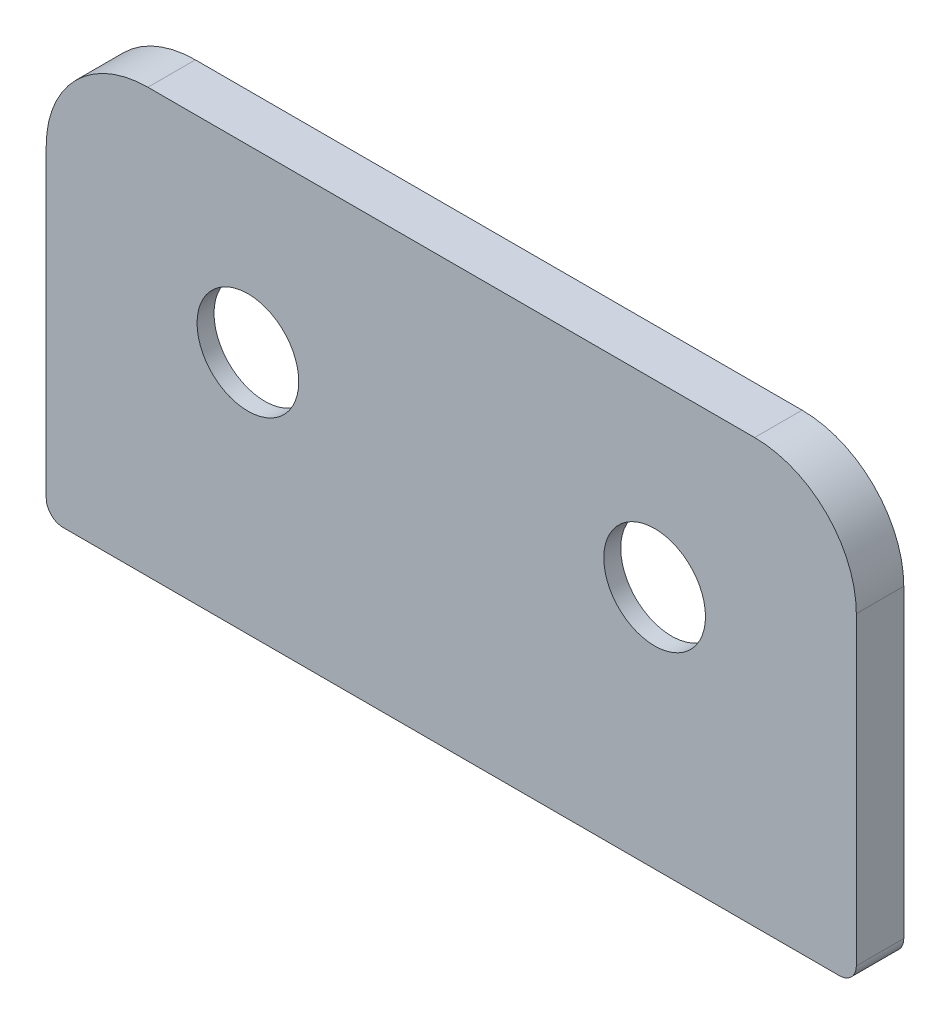
ISO-10303-21;
HEADER;
FILE_DESCRIPTION(('STEP AP214'),'2;1');
FILE_NAME('part.step','',(''),(''),'','','');
FILE_SCHEMA(('AUTOMOTIVE_DESIGN { 1 0 10303 214 1 1 1 1 }'));
ENDSEC;
DATA;
#1=APPLICATION_CONTEXT('core data for automotive mechanical design processes');
#2=APPLICATION_PROTOCOL_DEFINITION('international standard','automotive_design',2000,#1);
#3=PRODUCT_CONTEXT('',#1,'mechanical');
#4=PRODUCT('Part','Part','',(#3));
#5=PRODUCT_RELATED_PRODUCT_CATEGORY('part','',(#4));
#6=PRODUCT_DEFINITION_FORMATION('','',#4);
#7=PRODUCT_DEFINITION_CONTEXT('part definition',#1,'design');
#8=PRODUCT_DEFINITION('design','',#6,#7);
#9=PRODUCT_DEFINITION_SHAPE('','',#8);
#10=(LENGTH_UNIT() NAMED_UNIT(*) SI_UNIT(.MILLI.,.METRE.));
#11=(NAMED_UNIT(*) PLANE_ANGLE_UNIT() SI_UNIT($,.RADIAN.));
#12=(NAMED_UNIT(*) SI_UNIT($,.STERADIAN.) SOLID_ANGLE_UNIT());
#13=UNCERTAINTY_MEASURE_WITH_UNIT(LENGTH_MEASURE(1.E-05),#10,'distance_accuracy_value','');
#14=(GEOMETRIC_REPRESENTATION_CONTEXT(3) GLOBAL_UNCERTAINTY_ASSIGNED_CONTEXT((#13)) GLOBAL_UNIT_ASSIGNED_CONTEXT((#10,
#11,#12)) REPRESENTATION_CONTEXT('',''));
#15=CARTESIAN_POINT('',(0.,0.,0.));
#16=DIRECTION('',(0.,0.,1.));
#17=DIRECTION('',(1.,0.,0.));
#18=AXIS2_PLACEMENT_3D('',#15,#16,#17);
#19=CARTESIAN_POINT('',(-6.,0.949999999999997,1.4));
#20=DIRECTION('',(0.,0.,-1.));
#21=DIRECTION('',(-1.,0.,0.));
#22=AXIS2_PLACEMENT_3D('',#19,#20,#21);
#23=CYLINDRICAL_SURFACE('',#22,1.5);
#24=CARTESIAN_POINT('',(-6.,0.949999999999997,1.4));
#25=DIRECTION('',(0.,0.,1.));
#26=DIRECTION('',(1.,0.,0.));
#27=AXIS2_PLACEMENT_3D('',#24,#25,#26);
#28=CIRCLE('',#27,1.5);
#29=CARTESIAN_POINT('',(-4.5,0.949999999999997,1.4));
#30=VERTEX_POINT('',#29);
#31=EDGE_CURVE('E156',#30,#30,#28,.T.);
#32=ORIENTED_EDGE('',*,*,#31,.T.);
#33=EDGE_LOOP('',(#32));
#34=FACE_BOUND('',#33,.T.);
#35=CARTESIAN_POINT('',(-6.,0.949999999999997,0.9));
#36=DIRECTION('',(0.,0.,-1.));
#37=DIRECTION('',(-1.,0.,0.));
#38=AXIS2_PLACEMENT_3D('',#35,#36,#37);
#39=CIRCLE('',#38,1.5);
#40=CARTESIAN_POINT('',(-7.5,0.949999999999997,0.9));
#41=VERTEX_POINT('',#40);
#42=EDGE_CURVE('E38',#41,#41,#39,.T.);
#43=ORIENTED_EDGE('',*,*,#42,.T.);
#44=EDGE_LOOP('',(#43));
#45=FACE_BOUND('',#44,.T.);
#46=ADVANCED_FACE('F35',(#34,#45),#23,.F.);
#47=CARTESIAN_POINT('',(6.,0.949999999999998,1.4));
#48=DIRECTION('',(0.,0.,-1.));
#49=DIRECTION('',(-1.,0.,0.));
#50=AXIS2_PLACEMENT_3D('',#47,#48,#49);
#51=CYLINDRICAL_SURFACE('',#50,1.5);
#52=CARTESIAN_POINT('',(6.,0.949999999999998,1.4));
#53=DIRECTION('',(0.,0.,1.));
#54=DIRECTION('',(1.,0.,0.));
#55=AXIS2_PLACEMENT_3D('',#52,#53,#54);
#56=CIRCLE('',#55,1.5);
#57=CARTESIAN_POINT('',(7.5,0.949999999999998,1.4));
#58=VERTEX_POINT('',#57);
#59=EDGE_CURVE('E172',#58,#58,#56,.T.);
#60=ORIENTED_EDGE('',*,*,#59,.T.);
#61=EDGE_LOOP('',(#60));
#62=FACE_BOUND('',#61,.T.);
#63=CARTESIAN_POINT('',(6.,0.949999999999998,0.9));
#64=DIRECTION('',(0.,0.,-1.));
#65=DIRECTION('',(-1.,0.,0.));
#66=AXIS2_PLACEMENT_3D('',#63,#64,#65);
#67=CIRCLE('',#66,1.5);
#68=CARTESIAN_POINT('',(4.5,0.949999999999998,0.9));
#69=VERTEX_POINT('',#68);
#70=EDGE_CURVE('E137',#69,#69,#67,.T.);
#71=ORIENTED_EDGE('',*,*,#70,.T.);
#72=EDGE_LOOP('',(#71));
#73=FACE_BOUND('',#72,.T.);
#74=ADVANCED_FACE('F204',(#62,#73),#51,.F.);
#75=CARTESIAN_POINT('',(-11.45,-5.75,1.4));
#76=DIRECTION('',(0.,0.,-1.));
#77=DIRECTION('',(-1.,0.,0.));
#78=AXIS2_PLACEMENT_3D('',#75,#76,#77);
#79=CYLINDRICAL_SURFACE('',#78,0.5);
#80=CARTESIAN_POINT('',(-11.45,-5.75,0.));
#81=DIRECTION('',(0.,0.,1.));
#82=DIRECTION('',(1.,0.,0.));
#83=AXIS2_PLACEMENT_3D('',#80,#81,#82);
#84=CIRCLE('',#83,0.5);
#85=CARTESIAN_POINT('',(-11.45,-6.25,0.));
#86=VERTEX_POINT('',#85);
#87=CARTESIAN_POINT('',(-11.95,-5.75,0.));
#88=VERTEX_POINT('',#87);
#89=EDGE_CURVE('E139',#86,#88,#84,.F.);
#90=ORIENTED_EDGE('',*,*,#89,.F.);
#91=DIRECTION('',(0.,0.,-1.));
#92=VECTOR('',#91,1.);
#93=CARTESIAN_POINT('',(-11.45,-6.25,1.4));
#94=LINE('',#93,#92);
#95=CARTESIAN_POINT('',(-11.45,-6.25,1.4));
#96=VERTEX_POINT('',#95);
#97=EDGE_CURVE('E11',#96,#86,#94,.T.);
#98=ORIENTED_EDGE('',*,*,#97,.F.);
#99=CARTESIAN_POINT('',(-11.45,-5.75,1.4));
#100=DIRECTION('',(0.,0.,1.));
#101=DIRECTION('',(1.,0.,0.));
#102=AXIS2_PLACEMENT_3D('',#99,#100,#101);
#103=CIRCLE('',#102,0.5);
#104=CARTESIAN_POINT('',(-11.95,-5.75,1.4));
#105=VERTEX_POINT('',#104);
#106=EDGE_CURVE('E159',#96,#105,#103,.F.);
#107=ORIENTED_EDGE('',*,*,#106,.T.);
#108=DIRECTION('',(0.,0.,-1.));
#109=VECTOR('',#108,1.);
#110=CARTESIAN_POINT('',(-11.95,-5.75,1.4));
#111=LINE('',#110,#109);
#112=EDGE_CURVE('E53',#105,#88,#111,.T.);
#113=ORIENTED_EDGE('',*,*,#112,.T.);
#114=EDGE_LOOP('',(#90,#98,#107,#113));
#115=FACE_BOUND('',#114,.T.);
#116=ADVANCED_FACE('F209',(#115),#79,.T.);
#117=CARTESIAN_POINT('',(0.,-6.25,1.4));
#118=DIRECTION('',(0.,-1.,0.));
#119=DIRECTION('',(1.,0.,0.));
#120=AXIS2_PLACEMENT_3D('',#117,#118,#119);
#121=PLANE('',#120);
#122=DIRECTION('',(-1.,0.,0.));
#123=VECTOR('',#122,1.);
#124=CARTESIAN_POINT('',(0.,-6.25,0.));
#125=LINE('',#124,#123);
#126=CARTESIAN_POINT('',(11.45,-6.25,0.));
#127=VERTEX_POINT('',#126);
#128=EDGE_CURVE('E143',#127,#86,#125,.T.);
#129=ORIENTED_EDGE('',*,*,#128,.F.);
#130=DIRECTION('',(0.,0.,-1.));
#131=VECTOR('',#130,1.);
#132=CARTESIAN_POINT('',(11.45,-6.25,1.4));
#133=LINE('',#132,#131);
#134=CARTESIAN_POINT('',(11.45,-6.25,1.4));
#135=VERTEX_POINT('',#134);
#136=EDGE_CURVE('E44',#135,#127,#133,.T.);
#137=ORIENTED_EDGE('',*,*,#136,.F.);
#138=DIRECTION('',(-1.,0.,0.));
#139=VECTOR('',#138,1.);
#140=CARTESIAN_POINT('',(0.,-6.25,1.4));
#141=LINE('',#140,#139);
#142=EDGE_CURVE('E162',#135,#96,#141,.T.);
#143=ORIENTED_EDGE('',*,*,#142,.T.);
#144=ORIENTED_EDGE('',*,*,#97,.T.);
#145=EDGE_LOOP('',(#129,#137,#143,#144));
#146=FACE_BOUND('',#145,.T.);
#147=ADVANCED_FACE('F322',(#146),#121,.T.);
#148=CARTESIAN_POINT('',(11.45,-5.75,1.4));
#149=DIRECTION('',(0.,0.,-1.));
#150=DIRECTION('',(-1.,0.,0.));
#151=AXIS2_PLACEMENT_3D('',#148,#149,#150);
#152=CYLINDRICAL_SURFACE('',#151,0.5);
#153=CARTESIAN_POINT('',(11.45,-5.75,0.));
#154=DIRECTION('',(0.,0.,1.));
#155=DIRECTION('',(1.,0.,0.));
#156=AXIS2_PLACEMENT_3D('',#153,#154,#155);
#157=CIRCLE('',#156,0.5);
#158=CARTESIAN_POINT('',(11.95,-5.75,0.));
#159=VERTEX_POINT('',#158);
#160=EDGE_CURVE('E177',#127,#159,#157,.T.);
#161=ORIENTED_EDGE('',*,*,#160,.T.);
#162=DIRECTION('',(0.,0.,-1.));
#163=VECTOR('',#162,1.);
#164=CARTESIAN_POINT('',(11.95,-5.75,1.4));
#165=LINE('',#164,#163);
#166=CARTESIAN_POINT('',(11.95,-5.75,1.4));
#167=VERTEX_POINT('',#166);
#168=EDGE_CURVE('E134',#167,#159,#165,.T.);
#169=ORIENTED_EDGE('',*,*,#168,.F.);
#170=CARTESIAN_POINT('',(11.45,-5.75,1.4));
#171=DIRECTION('',(0.,0.,1.));
#172=DIRECTION('',(1.,0.,0.));
#173=AXIS2_PLACEMENT_3D('',#170,#171,#172);
#174=CIRCLE('',#173,0.5);
#175=EDGE_CURVE('E165',#135,#167,#174,.T.);
#176=ORIENTED_EDGE('',*,*,#175,.F.);
#177=ORIENTED_EDGE('',*,*,#136,.T.);
#178=EDGE_LOOP('',(#161,#169,#176,#177));
#179=FACE_BOUND('',#178,.T.);
#180=ADVANCED_FACE('F312',(#179),#152,.T.);
#181=CARTESIAN_POINT('',(11.95,0.,1.4));
#182=DIRECTION('',(-1.,0.,0.));
#183=DIRECTION('',(0.,0.,1.));
#184=AXIS2_PLACEMENT_3D('',#181,#182,#183);
#185=PLANE('',#184);
#186=DIRECTION('',(0.,1.,0.));
#187=VECTOR('',#186,1.);
#188=CARTESIAN_POINT('',(11.95,0.,0.));
#189=LINE('',#188,#187);
#190=CARTESIAN_POINT('',(11.95,3.24999999999998,0.));
#191=VERTEX_POINT('',#190);
#192=EDGE_CURVE('E180',#159,#191,#189,.T.);
#193=ORIENTED_EDGE('',*,*,#192,.T.);
#194=DIRECTION('',(0.,0.,-1.));
#195=VECTOR('',#194,1.);
#196=CARTESIAN_POINT('',(11.95,3.24999999999998,1.4));
#197=LINE('',#196,#195);
#198=CARTESIAN_POINT('',(11.95,3.24999999999998,1.4));
#199=VERTEX_POINT('',#198);
#200=EDGE_CURVE('E127',#199,#191,#197,.T.);
#201=ORIENTED_EDGE('',*,*,#200,.F.);
#202=DIRECTION('',(0.,1.,0.));
#203=VECTOR('',#202,1.);
#204=CARTESIAN_POINT('',(11.95,0.,1.4));
#205=LINE('',#204,#203);
#206=EDGE_CURVE('E168',#167,#199,#205,.T.);
#207=ORIENTED_EDGE('',*,*,#206,.F.);
#208=ORIENTED_EDGE('',*,*,#168,.T.);
#209=EDGE_LOOP('',(#193,#201,#207,#208));
#210=FACE_BOUND('',#209,.T.);
#211=ADVANCED_FACE('F302',(#210),#185,.F.);
#212=CARTESIAN_POINT('',(8.95,3.25,1.4));
#213=DIRECTION('',(0.,0.,-1.));
#214=DIRECTION('',(-1.,0.,0.));
#215=AXIS2_PLACEMENT_3D('',#212,#213,#214);
#216=CYLINDRICAL_SURFACE('',#215,3.);
#217=CARTESIAN_POINT('',(8.95,3.25,0.));
#218=DIRECTION('',(0.,0.,1.));
#219=DIRECTION('',(1.,0.,0.));
#220=AXIS2_PLACEMENT_3D('',#217,#218,#219);
#221=CIRCLE('',#220,3.);
#222=CARTESIAN_POINT('',(8.94999999999998,6.25,0.));
#223=VERTEX_POINT('',#222);
#224=EDGE_CURVE('E183',#191,#223,#221,.T.);
#225=ORIENTED_EDGE('',*,*,#224,.T.);
#226=DIRECTION('',(0.,0.,-1.));
#227=VECTOR('',#226,1.);
#228=CARTESIAN_POINT('',(8.94999999999998,6.25,1.4));
#229=LINE('',#228,#227);
#230=CARTESIAN_POINT('',(8.94999999999998,6.25,1.4));
#231=VERTEX_POINT('',#230);
#232=EDGE_CURVE('E125',#231,#223,#229,.T.);
#233=ORIENTED_EDGE('',*,*,#232,.F.);
#234=CARTESIAN_POINT('',(8.95,3.25,1.4));
#235=DIRECTION('',(0.,0.,1.));
#236=DIRECTION('',(1.,0.,0.));
#237=AXIS2_PLACEMENT_3D('',#234,#235,#236);
#238=CIRCLE('',#237,3.);
#239=EDGE_CURVE('E118',#199,#231,#238,.T.);
#240=ORIENTED_EDGE('',*,*,#239,.F.);
#241=ORIENTED_EDGE('',*,*,#200,.T.);
#242=EDGE_LOOP('',(#225,#233,#240,#241));
#243=FACE_BOUND('',#242,.T.);
#244=ADVANCED_FACE('F293',(#243),#216,.T.);
#245=CARTESIAN_POINT('',(0.,6.25,1.4));
#246=DIRECTION('',(0.,-1.,0.));
#247=DIRECTION('',(1.,0.,0.));
#248=AXIS2_PLACEMENT_3D('',#245,#246,#247);
#249=PLANE('',#248);
#250=DIRECTION('',(-1.,0.,0.));
#251=VECTOR('',#250,1.);
#252=CARTESIAN_POINT('',(0.,6.25,0.));
#253=LINE('',#252,#251);
#254=CARTESIAN_POINT('',(-8.94999999999997,6.25,0.));
#255=VERTEX_POINT('',#254);
#256=EDGE_CURVE('E124',#223,#255,#253,.T.);
#257=ORIENTED_EDGE('',*,*,#256,.T.);
#258=DIRECTION('',(0.,0.,-1.));
#259=VECTOR('',#258,1.);
#260=CARTESIAN_POINT('',(-8.94999999999997,6.25,1.4));
#261=LINE('',#260,#259);
#262=CARTESIAN_POINT('',(-8.94999999999997,6.25,1.4));
#263=VERTEX_POINT('',#262);
#264=EDGE_CURVE('E107',#263,#255,#261,.T.);
#265=ORIENTED_EDGE('',*,*,#264,.F.);
#266=DIRECTION('',(-1.,0.,0.));
#267=VECTOR('',#266,1.);
#268=CARTESIAN_POINT('',(0.,6.25,1.4));
#269=LINE('',#268,#267);
#270=EDGE_CURVE('E112',#231,#263,#269,.T.);
#271=ORIENTED_EDGE('',*,*,#270,.F.);
#272=ORIENTED_EDGE('',*,*,#232,.T.);
#273=EDGE_LOOP('',(#257,#265,#271,#272));
#274=FACE_BOUND('',#273,.T.);
#275=ADVANCED_FACE('F123',(#274),#249,.F.);
#276=CARTESIAN_POINT('',(-8.94999999999999,3.25,1.4));
#277=DIRECTION('',(0.,0.,-1.));
#278=DIRECTION('',(-1.,0.,0.));
#279=AXIS2_PLACEMENT_3D('',#276,#277,#278);
#280=CYLINDRICAL_SURFACE('',#279,3.);
#281=CARTESIAN_POINT('',(-8.94999999999999,3.25,0.));
#282=DIRECTION('',(0.,0.,1.));
#283=DIRECTION('',(1.,0.,0.));
#284=AXIS2_PLACEMENT_3D('',#281,#282,#283);
#285=CIRCLE('',#284,3.);
#286=CARTESIAN_POINT('',(-11.95,3.24999999999998,0.));
#287=VERTEX_POINT('',#286);
#288=EDGE_CURVE('E187',#255,#287,#285,.T.);
#289=ORIENTED_EDGE('',*,*,#288,.T.);
#290=DIRECTION('',(0.,0.,-1.));
#291=VECTOR('',#290,1.);
#292=CARTESIAN_POINT('',(-11.95,3.24999999999998,1.4));
#293=LINE('',#292,#291);
#294=CARTESIAN_POINT('',(-11.95,3.24999999999998,1.4));
#295=VERTEX_POINT('',#294);
#296=EDGE_CURVE('E79',#295,#287,#293,.T.);
#297=ORIENTED_EDGE('',*,*,#296,.F.);
#298=CARTESIAN_POINT('',(-8.94999999999999,3.25,1.4));
#299=DIRECTION('',(0.,0.,1.));
#300=DIRECTION('',(1.,0.,0.));
#301=AXIS2_PLACEMENT_3D('',#298,#299,#300);
#302=CIRCLE('',#301,3.);
#303=EDGE_CURVE('E103',#263,#295,#302,.T.);
#304=ORIENTED_EDGE('',*,*,#303,.F.);
#305=ORIENTED_EDGE('',*,*,#264,.T.);
#306=EDGE_LOOP('',(#289,#297,#304,#305));
#307=FACE_BOUND('',#306,.T.);
#308=ADVANCED_FACE('F105',(#307),#280,.T.);
#309=CARTESIAN_POINT('',(-11.95,0.,1.4));
#310=DIRECTION('',(-1.,0.,0.));
#311=DIRECTION('',(0.,0.,1.));
#312=AXIS2_PLACEMENT_3D('',#309,#310,#311);
#313=PLANE('',#312);
#314=DIRECTION('',(0.,1.,0.));
#315=VECTOR('',#314,1.);
#316=CARTESIAN_POINT('',(-11.95,0.,0.));
#317=LINE('',#316,#315);
#318=EDGE_CURVE('E160',#88,#287,#317,.T.);
#319=ORIENTED_EDGE('',*,*,#318,.F.);
#320=ORIENTED_EDGE('',*,*,#112,.F.);
#321=DIRECTION('',(0.,1.,0.));
#322=VECTOR('',#321,1.);
#323=CARTESIAN_POINT('',(-11.95,0.,1.4));
#324=LINE('',#323,#322);
#325=EDGE_CURVE('E111',#105,#295,#324,.T.);
#326=ORIENTED_EDGE('',*,*,#325,.T.);
#327=ORIENTED_EDGE('',*,*,#296,.T.);
#328=EDGE_LOOP('',(#319,#320,#326,#327));
#329=FACE_BOUND('',#328,.T.);
#330=ADVANCED_FACE('F192',(#329),#313,.T.);
#331=CARTESIAN_POINT('',(0.,0.,1.4));
#332=DIRECTION('',(0.,0.,1.));
#333=DIRECTION('',(1.,0.,0.));
#334=AXIS2_PLACEMENT_3D('',#331,#332,#333);
#335=PLANE('',#334);
#336=ORIENTED_EDGE('',*,*,#31,.F.);
#337=EDGE_LOOP('',(#336));
#338=FACE_BOUND('',#337,.T.);
#339=ORIENTED_EDGE('',*,*,#106,.F.);
#340=ORIENTED_EDGE('',*,*,#142,.F.);
#341=ORIENTED_EDGE('',*,*,#175,.T.);
#342=ORIENTED_EDGE('',*,*,#206,.T.);
#343=ORIENTED_EDGE('',*,*,#239,.T.);
#344=ORIENTED_EDGE('',*,*,#270,.T.);
#345=ORIENTED_EDGE('',*,*,#303,.T.);
#346=ORIENTED_EDGE('',*,*,#325,.F.);
#347=EDGE_LOOP('',(#339,#340,#341,#342,#343,#344,#345,#346));
#348=FACE_BOUND('',#347,.T.);
#349=ORIENTED_EDGE('',*,*,#59,.F.);
#350=EDGE_LOOP('',(#349));
#351=FACE_BOUND('',#350,.T.);
#352=ADVANCED_FACE('F115',(#338,#348,#351),#335,.T.);
#353=CARTESIAN_POINT('',(0.,0.,0.));
#354=DIRECTION('',(0.,0.,1.));
#355=DIRECTION('',(1.,0.,0.));
#356=AXIS2_PLACEMENT_3D('',#353,#354,#355);
#357=PLANE('',#356);
#358=CARTESIAN_POINT('',(-6.,0.949999999999997,0.));
#359=DIRECTION('',(0.,0.,-1.));
#360=DIRECTION('',(-1.,0.,0.));
#361=AXIS2_PLACEMENT_3D('',#358,#359,#360);
#362=CIRCLE('',#361,3.98621329931774);
#363=CARTESIAN_POINT('',(-9.98621329931774,0.949999999999997,0.));
#364=VERTEX_POINT('',#363);
#365=EDGE_CURVE('E153',#364,#364,#362,.T.);
#366=ORIENTED_EDGE('',*,*,#365,.F.);
#367=EDGE_LOOP('',(#366));
#368=FACE_BOUND('',#367,.T.);
#369=CARTESIAN_POINT('',(6.,0.949999999999998,0.));
#370=DIRECTION('',(0.,0.,-1.));
#371=DIRECTION('',(-1.,0.,0.));
#372=AXIS2_PLACEMENT_3D('',#369,#370,#371);
#373=CIRCLE('',#372,3.98621329931774);
#374=CARTESIAN_POINT('',(2.01378670068226,0.949999999999998,0.));
#375=VERTEX_POINT('',#374);
#376=EDGE_CURVE('E146',#375,#375,#373,.T.);
#377=ORIENTED_EDGE('',*,*,#376,.F.);
#378=EDGE_LOOP('',(#377));
#379=FACE_BOUND('',#378,.T.);
#380=ORIENTED_EDGE('',*,*,#89,.T.);
#381=ORIENTED_EDGE('',*,*,#318,.T.);
#382=ORIENTED_EDGE('',*,*,#288,.F.);
#383=ORIENTED_EDGE('',*,*,#256,.F.);
#384=ORIENTED_EDGE('',*,*,#224,.F.);
#385=ORIENTED_EDGE('',*,*,#192,.F.);
#386=ORIENTED_EDGE('',*,*,#160,.F.);
#387=ORIENTED_EDGE('',*,*,#128,.T.);
#388=EDGE_LOOP('',(#380,#381,#382,#383,#384,#385,#386,#387));
#389=FACE_BOUND('',#388,.T.);
#390=ADVANCED_FACE('F191',(#368,#379,#389),#357,.F.);
#391=CARTESIAN_POINT('',(6.,0.949999999999998,0.9));
#392=DIRECTION('',(0.,0.,-1.));
#393=DIRECTION('',(-1.,0.,0.));
#394=AXIS2_PLACEMENT_3D('',#391,#392,#393);
#395=CYLINDRICAL_SURFACE('',#394,3.98621329931774);
#396=CARTESIAN_POINT('',(6.,0.949999999999998,0.9));
#397=DIRECTION('',(0.,0.,-1.));
#398=DIRECTION('',(-1.,0.,0.));
#399=AXIS2_PLACEMENT_3D('',#396,#397,#398);
#400=CIRCLE('',#399,3.98621329931774);
#401=CARTESIAN_POINT('',(2.01378670068226,0.949999999999998,0.9));
#402=VERTEX_POINT('',#401);
#403=EDGE_CURVE('E140',#402,#402,#400,.T.);
#404=ORIENTED_EDGE('',*,*,#403,.F.);
#405=EDGE_LOOP('',(#404));
#406=FACE_BOUND('',#405,.T.);
#407=ORIENTED_EDGE('',*,*,#376,.T.);
#408=EDGE_LOOP('',(#407));
#409=FACE_BOUND('',#408,.T.);
#410=ADVANCED_FACE('F227',(#406,#409),#395,.F.);
#411=CARTESIAN_POINT('',(6.,0.949999999999998,0.9));
#412=DIRECTION('',(0.,0.,-1.));
#413=DIRECTION('',(-1.,0.,0.));
#414=AXIS2_PLACEMENT_3D('',#411,#412,#413);
#415=PLANE('',#414);
#416=ORIENTED_EDGE('',*,*,#70,.F.);
#417=EDGE_LOOP('',(#416));
#418=FACE_BOUND('',#417,.T.);
#419=ORIENTED_EDGE('',*,*,#403,.T.);
#420=EDGE_LOOP('',(#419));
#421=FACE_BOUND('',#420,.T.);
#422=ADVANCED_FACE('F232',(#418,#421),#415,.T.);
#423=CARTESIAN_POINT('',(-6.,0.949999999999997,0.9));
#424=DIRECTION('',(0.,0.,-1.));
#425=DIRECTION('',(-1.,0.,0.));
#426=AXIS2_PLACEMENT_3D('',#423,#424,#425);
#427=CYLINDRICAL_SURFACE('',#426,3.98621329931774);
#428=CARTESIAN_POINT('',(-6.,0.949999999999997,0.9));
#429=DIRECTION('',(0.,0.,-1.));
#430=DIRECTION('',(-1.,0.,0.));
#431=AXIS2_PLACEMENT_3D('',#428,#429,#430);
#432=CIRCLE('',#431,3.98621329931774);
#433=CARTESIAN_POINT('',(-9.98621329931774,0.949999999999997,0.9));
#434=VERTEX_POINT('',#433);
#435=EDGE_CURVE('E216',#434,#434,#432,.T.);
#436=ORIENTED_EDGE('',*,*,#435,.F.);
#437=EDGE_LOOP('',(#436));
#438=FACE_BOUND('',#437,.T.);
#439=ORIENTED_EDGE('',*,*,#365,.T.);
#440=EDGE_LOOP('',(#439));
#441=FACE_BOUND('',#440,.T.);
#442=ADVANCED_FACE('F223',(#438,#441),#427,.F.);
#443=CARTESIAN_POINT('',(-6.,0.949999999999997,0.9));
#444=DIRECTION('',(0.,0.,-1.));
#445=DIRECTION('',(-1.,0.,0.));
#446=AXIS2_PLACEMENT_3D('',#443,#444,#445);
#447=PLANE('',#446);
#448=ORIENTED_EDGE('',*,*,#42,.F.);
#449=EDGE_LOOP('',(#448));
#450=FACE_BOUND('',#449,.T.);
#451=ORIENTED_EDGE('',*,*,#435,.T.);
#452=EDGE_LOOP('',(#451));
#453=FACE_BOUND('',#452,.T.);
#454=ADVANCED_FACE('F243',(#450,#453),#447,.T.);
#455=CLOSED_SHELL('',(#46,#74,#116,#147,#180,#211,#244,#275,#308,#330,#352,#390,#410,#422,#442,#454));
#456=MANIFOLD_SOLID_BREP('B2',#455);
#457=ADVANCED_BREP_SHAPE_REPRESENTATION('',(#18,#456),#14);
#458=SHAPE_DEFINITION_REPRESENTATION(#9,#457);
ENDSEC;
END-ISO-10303-21;
